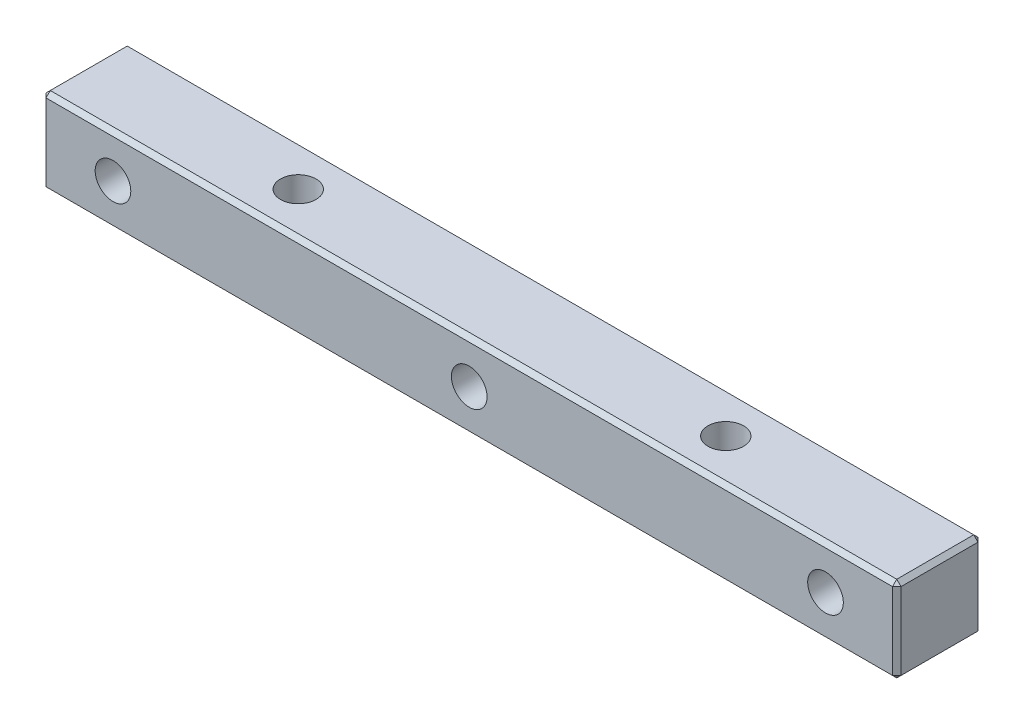
ISO-10303-21;
HEADER;
FILE_DESCRIPTION(('STEP AP214'),'2;1');
FILE_NAME('part.step','',(''),(''),'','','');
FILE_SCHEMA(('AUTOMOTIVE_DESIGN { 1 0 10303 214 1 1 1 1 }'));
ENDSEC;
DATA;
#1=APPLICATION_CONTEXT('core data for automotive mechanical design processes');
#2=APPLICATION_PROTOCOL_DEFINITION('international standard','automotive_design',2000,#1);
#3=PRODUCT_CONTEXT('',#1,'mechanical');
#4=PRODUCT('Part','Part','',(#3));
#5=PRODUCT_RELATED_PRODUCT_CATEGORY('part','',(#4));
#6=PRODUCT_DEFINITION_FORMATION('','',#4);
#7=PRODUCT_DEFINITION_CONTEXT('part definition',#1,'design');
#8=PRODUCT_DEFINITION('design','',#6,#7);
#9=PRODUCT_DEFINITION_SHAPE('','',#8);
#10=(LENGTH_UNIT() NAMED_UNIT(*) SI_UNIT(.MILLI.,.METRE.));
#11=(NAMED_UNIT(*) PLANE_ANGLE_UNIT() SI_UNIT($,.RADIAN.));
#12=(NAMED_UNIT(*) SI_UNIT($,.STERADIAN.) SOLID_ANGLE_UNIT());
#13=UNCERTAINTY_MEASURE_WITH_UNIT(LENGTH_MEASURE(1.E-05),#10,'distance_accuracy_value','');
#14=(GEOMETRIC_REPRESENTATION_CONTEXT(3) GLOBAL_UNCERTAINTY_ASSIGNED_CONTEXT((#13)) GLOBAL_UNIT_ASSIGNED_CONTEXT((#10,
#11,#12)) REPRESENTATION_CONTEXT('',''));
#15=CARTESIAN_POINT('',(0.,0.,0.));
#16=DIRECTION('',(0.,0.,1.));
#17=DIRECTION('',(1.,0.,0.));
#18=AXIS2_PLACEMENT_3D('',#15,#16,#17);
#19=CARTESIAN_POINT('',(30.,-3.,3.));
#20=DIRECTION('',(-1.,0.,0.));
#21=DIRECTION('',(0.,0.,1.));
#22=AXIS2_PLACEMENT_3D('',#19,#20,#21);
#23=PLANE('',#22);
#24=DIRECTION('',(0.,0.,1.));
#25=VECTOR('',#24,1.);
#26=CARTESIAN_POINT('',(30.,2.69999999999999,3.));
#27=LINE('',#26,#25);
#28=CARTESIAN_POINT('',(30.,2.69999999999999,-2.69999999999999));
#29=VERTEX_POINT('',#28);
#30=CARTESIAN_POINT('',(30.,2.69999999999999,2.69999999999999));
#31=VERTEX_POINT('',#30);
#32=EDGE_CURVE('E207',#29,#31,#27,.T.);
#33=ORIENTED_EDGE('',*,*,#32,.T.);
#34=DIRECTION('',(0.,-1.,0.));
#35=VECTOR('',#34,1.);
#36=CARTESIAN_POINT('',(30.,-3.,2.69999999999999));
#37=LINE('',#36,#35);
#38=CARTESIAN_POINT('',(30.,-2.69999999999999,2.69999999999999));
#39=VERTEX_POINT('',#38);
#40=EDGE_CURVE('E11',#31,#39,#37,.T.);
#41=ORIENTED_EDGE('',*,*,#40,.T.);
#42=DIRECTION('',(0.,0.,-1.));
#43=VECTOR('',#42,1.);
#44=CARTESIAN_POINT('',(30.,-2.69999999999999,3.));
#45=LINE('',#44,#43);
#46=CARTESIAN_POINT('',(30.,-2.69999999999999,-2.69999999999999));
#47=VERTEX_POINT('',#46);
#48=EDGE_CURVE('E50',#39,#47,#45,.T.);
#49=ORIENTED_EDGE('',*,*,#48,.T.);
#50=DIRECTION('',(0.,1.,0.));
#51=VECTOR('',#50,1.);
#52=CARTESIAN_POINT('',(30.,3.,-2.69999999999999));
#53=LINE('',#52,#51);
#54=EDGE_CURVE('E209',#47,#29,#53,.T.);
#55=ORIENTED_EDGE('',*,*,#54,.T.);
#56=EDGE_LOOP('',(#33,#41,#49,#55));
#57=FACE_BOUND('',#56,.T.);
#58=ADVANCED_FACE('F40',(#57),#23,.F.);
#59=CARTESIAN_POINT('',(-30.,3.,3.));
#60=DIRECTION('',(0.,-1.,0.));
#61=DIRECTION('',(0.,0.,-1.));
#62=AXIS2_PLACEMENT_3D('',#59,#60,#61);
#63=PLANE('',#62);
#64=DIRECTION('',(-1.,0.,0.));
#65=VECTOR('',#64,1.);
#66=CARTESIAN_POINT('',(-30.,3.,-2.69999999999999));
#67=LINE('',#66,#65);
#68=CARTESIAN_POINT('',(29.7,3.,-2.69999999999999));
#69=VERTEX_POINT('',#68);
#70=CARTESIAN_POINT('',(-29.7,3.,-2.69999999999999));
#71=VERTEX_POINT('',#70);
#72=EDGE_CURVE('E177',#69,#71,#67,.T.);
#73=ORIENTED_EDGE('',*,*,#72,.T.);
#74=DIRECTION('',(0.,0.,1.));
#75=VECTOR('',#74,1.);
#76=CARTESIAN_POINT('',(-29.7,3.,3.));
#77=LINE('',#76,#75);
#78=CARTESIAN_POINT('',(-29.7,3.,2.69999999999999));
#79=VERTEX_POINT('',#78);
#80=EDGE_CURVE('E140',#71,#79,#77,.T.);
#81=ORIENTED_EDGE('',*,*,#80,.T.);
#82=DIRECTION('',(1.,0.,0.));
#83=VECTOR('',#82,1.);
#84=CARTESIAN_POINT('',(-30.,3.,2.69999999999999));
#85=LINE('',#84,#83);
#86=CARTESIAN_POINT('',(29.7,3.,2.69999999999999));
#87=VERTEX_POINT('',#86);
#88=EDGE_CURVE('E169',#79,#87,#85,.T.);
#89=ORIENTED_EDGE('',*,*,#88,.T.);
#90=DIRECTION('',(0.,0.,-1.));
#91=VECTOR('',#90,1.);
#92=CARTESIAN_POINT('',(29.7,3.,3.));
#93=LINE('',#92,#91);
#94=EDGE_CURVE('E171',#87,#69,#93,.T.);
#95=ORIENTED_EDGE('',*,*,#94,.T.);
#96=EDGE_LOOP('',(#73,#81,#89,#95));
#97=FACE_BOUND('',#96,.T.);
#98=CARTESIAN_POINT('',(-15.,3.,0.));
#99=DIRECTION('',(0.,1.,0.));
#100=DIRECTION('',(0.,0.,1.));
#101=AXIS2_PLACEMENT_3D('',#98,#99,#100);
#102=CIRCLE('',#101,1.24999999999999);
#103=CARTESIAN_POINT('',(-15.,3.,1.24999999999999));
#104=VERTEX_POINT('',#103);
#105=EDGE_CURVE('E265',#104,#104,#102,.T.);
#106=ORIENTED_EDGE('',*,*,#105,.F.);
#107=EDGE_LOOP('',(#106));
#108=FACE_BOUND('',#107,.T.);
#109=CARTESIAN_POINT('',(15.,3.,0.));
#110=DIRECTION('',(0.,1.,0.));
#111=DIRECTION('',(0.,0.,1.));
#112=AXIS2_PLACEMENT_3D('',#109,#110,#111);
#113=CIRCLE('',#112,1.24999999999999);
#114=CARTESIAN_POINT('',(15.,3.,1.24999999999998));
#115=VERTEX_POINT('',#114);
#116=EDGE_CURVE('E275',#115,#115,#113,.T.);
#117=ORIENTED_EDGE('',*,*,#116,.F.);
#118=EDGE_LOOP('',(#117));
#119=FACE_BOUND('',#118,.T.);
#120=ADVANCED_FACE('F323',(#97,#108,#119),#63,.F.);
#121=CARTESIAN_POINT('',(-30.,-3.,3.));
#122=DIRECTION('',(1.,0.,0.));
#123=DIRECTION('',(0.,0.,-1.));
#124=AXIS2_PLACEMENT_3D('',#121,#122,#123);
#125=PLANE('',#124);
#126=DIRECTION('',(0.,1.,0.));
#127=VECTOR('',#126,1.);
#128=CARTESIAN_POINT('',(-30.,-3.,2.69999999999999));
#129=LINE('',#128,#127);
#130=CARTESIAN_POINT('',(-30.,-2.69999999999999,2.69999999999999));
#131=VERTEX_POINT('',#130);
#132=CARTESIAN_POINT('',(-30.,2.69999999999999,2.69999999999999));
#133=VERTEX_POINT('',#132);
#134=EDGE_CURVE('E167',#131,#133,#129,.T.);
#135=ORIENTED_EDGE('',*,*,#134,.T.);
#136=DIRECTION('',(0.,0.,-1.));
#137=VECTOR('',#136,1.);
#138=CARTESIAN_POINT('',(-30.,2.69999999999999,3.));
#139=LINE('',#138,#137);
#140=CARTESIAN_POINT('',(-30.,2.69999999999999,-2.69999999999999));
#141=VERTEX_POINT('',#140);
#142=EDGE_CURVE('E138',#133,#141,#139,.T.);
#143=ORIENTED_EDGE('',*,*,#142,.T.);
#144=DIRECTION('',(0.,-1.,0.));
#145=VECTOR('',#144,1.);
#146=CARTESIAN_POINT('',(-30.,-3.,-2.69999999999999));
#147=LINE('',#146,#145);
#148=CARTESIAN_POINT('',(-30.,-2.69999999999999,-2.69999999999999));
#149=VERTEX_POINT('',#148);
#150=EDGE_CURVE('E156',#141,#149,#147,.T.);
#151=ORIENTED_EDGE('',*,*,#150,.T.);
#152=DIRECTION('',(0.,0.,1.));
#153=VECTOR('',#152,1.);
#154=CARTESIAN_POINT('',(-30.,-2.69999999999999,3.));
#155=LINE('',#154,#153);
#156=EDGE_CURVE('E162',#149,#131,#155,.T.);
#157=ORIENTED_EDGE('',*,*,#156,.T.);
#158=EDGE_LOOP('',(#135,#143,#151,#157));
#159=FACE_BOUND('',#158,.T.);
#160=ADVANCED_FACE('F165',(#159),#125,.F.);
#161=CARTESIAN_POINT('',(-30.,-3.,3.));
#162=DIRECTION('',(0.,1.,0.));
#163=DIRECTION('',(0.,0.,1.));
#164=AXIS2_PLACEMENT_3D('',#161,#162,#163);
#165=PLANE('',#164);
#166=DIRECTION('',(-1.,0.,0.));
#167=VECTOR('',#166,1.);
#168=CARTESIAN_POINT('',(-30.,-3.,2.69999999999999));
#169=LINE('',#168,#167);
#170=CARTESIAN_POINT('',(29.7,-3.,2.69999999999999));
#171=VERTEX_POINT('',#170);
#172=CARTESIAN_POINT('',(-29.7,-3.,2.69999999999999));
#173=VERTEX_POINT('',#172);
#174=EDGE_CURVE('E193',#171,#173,#169,.T.);
#175=ORIENTED_EDGE('',*,*,#174,.T.);
#176=DIRECTION('',(0.,0.,-1.));
#177=VECTOR('',#176,1.);
#178=CARTESIAN_POINT('',(-29.7,-3.,3.));
#179=LINE('',#178,#177);
#180=CARTESIAN_POINT('',(-29.7,-3.,-2.69999999999999));
#181=VERTEX_POINT('',#180);
#182=EDGE_CURVE('E195',#173,#181,#179,.T.);
#183=ORIENTED_EDGE('',*,*,#182,.T.);
#184=DIRECTION('',(1.,0.,0.));
#185=VECTOR('',#184,1.);
#186=CARTESIAN_POINT('',(30.,-3.,-2.69999999999999));
#187=LINE('',#186,#185);
#188=CARTESIAN_POINT('',(29.7,-3.,-2.69999999999999));
#189=VERTEX_POINT('',#188);
#190=EDGE_CURVE('E189',#181,#189,#187,.T.);
#191=ORIENTED_EDGE('',*,*,#190,.T.);
#192=DIRECTION('',(0.,0.,1.));
#193=VECTOR('',#192,1.);
#194=CARTESIAN_POINT('',(29.7,-3.,3.));
#195=LINE('',#194,#193);
#196=EDGE_CURVE('E191',#189,#171,#195,.T.);
#197=ORIENTED_EDGE('',*,*,#196,.T.);
#198=EDGE_LOOP('',(#175,#183,#191,#197));
#199=FACE_BOUND('',#198,.T.);
#200=CARTESIAN_POINT('',(-15.,-3.,0.));
#201=DIRECTION('',(0.,1.,0.));
#202=DIRECTION('',(0.,0.,1.));
#203=AXIS2_PLACEMENT_3D('',#200,#201,#202);
#204=CIRCLE('',#203,1.25);
#205=CARTESIAN_POINT('',(-15.,-3.,1.25));
#206=VERTEX_POINT('',#205);
#207=EDGE_CURVE('E270',#206,#206,#204,.T.);
#208=ORIENTED_EDGE('',*,*,#207,.T.);
#209=EDGE_LOOP('',(#208));
#210=FACE_BOUND('',#209,.T.);
#211=CARTESIAN_POINT('',(15.,-3.,0.));
#212=DIRECTION('',(0.,1.,0.));
#213=DIRECTION('',(0.,0.,1.));
#214=AXIS2_PLACEMENT_3D('',#211,#212,#213);
#215=CIRCLE('',#214,1.25);
#216=CARTESIAN_POINT('',(15.,-3.,1.24999999999999));
#217=VERTEX_POINT('',#216);
#218=EDGE_CURVE('E280',#217,#217,#215,.T.);
#219=ORIENTED_EDGE('',*,*,#218,.T.);
#220=EDGE_LOOP('',(#219));
#221=FACE_BOUND('',#220,.T.);
#222=ADVANCED_FACE('F456',(#199,#210,#221),#165,.F.);
#223=CARTESIAN_POINT('',(0.,0.,3.));
#224=DIRECTION('',(0.,0.,-1.));
#225=DIRECTION('',(-1.,0.,0.));
#226=AXIS2_PLACEMENT_3D('',#223,#224,#225);
#227=PLANE('',#226);
#228=DIRECTION('',(0.,-1.,0.));
#229=VECTOR('',#228,1.);
#230=CARTESIAN_POINT('',(-29.7,0.,3.));
#231=LINE('',#230,#229);
#232=CARTESIAN_POINT('',(-29.7,2.69999999999999,3.));
#233=VERTEX_POINT('',#232);
#234=CARTESIAN_POINT('',(-29.7,-2.69999999999999,3.));
#235=VERTEX_POINT('',#234);
#236=EDGE_CURVE('E184',#233,#235,#231,.T.);
#237=ORIENTED_EDGE('',*,*,#236,.T.);
#238=DIRECTION('',(1.,0.,0.));
#239=VECTOR('',#238,1.);
#240=CARTESIAN_POINT('',(0.,-2.69999999999999,3.));
#241=LINE('',#240,#239);
#242=CARTESIAN_POINT('',(29.7,-2.69999999999999,3.));
#243=VERTEX_POINT('',#242);
#244=EDGE_CURVE('E187',#235,#243,#241,.T.);
#245=ORIENTED_EDGE('',*,*,#244,.T.);
#246=DIRECTION('',(0.,1.,0.));
#247=VECTOR('',#246,1.);
#248=CARTESIAN_POINT('',(29.7,0.,3.));
#249=LINE('',#248,#247);
#250=CARTESIAN_POINT('',(29.7,2.69999999999999,3.));
#251=VERTEX_POINT('',#250);
#252=EDGE_CURVE('E182',#243,#251,#249,.T.);
#253=ORIENTED_EDGE('',*,*,#252,.T.);
#254=DIRECTION('',(-1.,0.,0.));
#255=VECTOR('',#254,1.);
#256=CARTESIAN_POINT('',(0.,2.69999999999999,3.));
#257=LINE('',#256,#255);
#258=EDGE_CURVE('E180',#251,#233,#257,.T.);
#259=ORIENTED_EDGE('',*,*,#258,.T.);
#260=EDGE_LOOP('',(#237,#245,#253,#259));
#261=FACE_BOUND('',#260,.T.);
#262=CARTESIAN_POINT('',(-25.,0.,3.));
#263=DIRECTION('',(0.,0.,1.));
#264=DIRECTION('',(1.,0.,0.));
#265=AXIS2_PLACEMENT_3D('',#262,#263,#264);
#266=CIRCLE('',#265,1.24999999999999);
#267=CARTESIAN_POINT('',(-23.75,0.,3.));
#268=VERTEX_POINT('',#267);
#269=EDGE_CURVE('E283',#268,#268,#266,.T.);
#270=ORIENTED_EDGE('',*,*,#269,.F.);
#271=EDGE_LOOP('',(#270));
#272=FACE_BOUND('',#271,.T.);
#273=CARTESIAN_POINT('',(0.,0.,3.));
#274=DIRECTION('',(0.,0.,1.));
#275=DIRECTION('',(1.,0.,0.));
#276=AXIS2_PLACEMENT_3D('',#273,#274,#275);
#277=CIRCLE('',#276,1.24999999999999);
#278=CARTESIAN_POINT('',(1.24999999999999,0.,3.));
#279=VERTEX_POINT('',#278);
#280=EDGE_CURVE('E289',#279,#279,#277,.T.);
#281=ORIENTED_EDGE('',*,*,#280,.F.);
#282=EDGE_LOOP('',(#281));
#283=FACE_BOUND('',#282,.T.);
#284=CARTESIAN_POINT('',(25.,0.,3.));
#285=DIRECTION('',(0.,0.,1.));
#286=DIRECTION('',(1.,0.,0.));
#287=AXIS2_PLACEMENT_3D('',#284,#285,#286);
#288=CIRCLE('',#287,1.24999999999999);
#289=CARTESIAN_POINT('',(26.25,0.,3.));
#290=VERTEX_POINT('',#289);
#291=EDGE_CURVE('E295',#290,#290,#288,.T.);
#292=ORIENTED_EDGE('',*,*,#291,.F.);
#293=EDGE_LOOP('',(#292));
#294=FACE_BOUND('',#293,.T.);
#295=ADVANCED_FACE('F466',(#261,#272,#283,#294),#227,.F.);
#296=CARTESIAN_POINT('',(0.,0.,-3.));
#297=DIRECTION('',(0.,0.,-1.));
#298=DIRECTION('',(-1.,0.,0.));
#299=AXIS2_PLACEMENT_3D('',#296,#297,#298);
#300=PLANE('',#299);
#301=DIRECTION('',(-1.,0.,0.));
#302=VECTOR('',#301,1.);
#303=CARTESIAN_POINT('',(-30.,-2.69999999999999,-3.));
#304=LINE('',#303,#302);
#305=CARTESIAN_POINT('',(29.7,-2.69999999999999,-3.));
#306=VERTEX_POINT('',#305);
#307=CARTESIAN_POINT('',(-29.7,-2.69999999999999,-3.));
#308=VERTEX_POINT('',#307);
#309=EDGE_CURVE('E202',#306,#308,#304,.T.);
#310=ORIENTED_EDGE('',*,*,#309,.T.);
#311=DIRECTION('',(0.,1.,0.));
#312=VECTOR('',#311,1.);
#313=CARTESIAN_POINT('',(-29.7,3.,-3.));
#314=LINE('',#313,#312);
#315=CARTESIAN_POINT('',(-29.7,2.69999999999999,-3.));
#316=VERTEX_POINT('',#315);
#317=EDGE_CURVE('E204',#308,#316,#314,.T.);
#318=ORIENTED_EDGE('',*,*,#317,.T.);
#319=DIRECTION('',(1.,0.,0.));
#320=VECTOR('',#319,1.);
#321=CARTESIAN_POINT('',(30.,2.69999999999999,-3.));
#322=LINE('',#321,#320);
#323=CARTESIAN_POINT('',(29.7,2.69999999999999,-3.));
#324=VERTEX_POINT('',#323);
#325=EDGE_CURVE('E198',#316,#324,#322,.T.);
#326=ORIENTED_EDGE('',*,*,#325,.T.);
#327=DIRECTION('',(0.,-1.,0.));
#328=VECTOR('',#327,1.);
#329=CARTESIAN_POINT('',(29.7,-3.,-3.));
#330=LINE('',#329,#328);
#331=EDGE_CURVE('E200',#324,#306,#330,.T.);
#332=ORIENTED_EDGE('',*,*,#331,.T.);
#333=EDGE_LOOP('',(#310,#318,#326,#332));
#334=FACE_BOUND('',#333,.T.);
#335=CARTESIAN_POINT('',(-25.,0.,-3.));
#336=DIRECTION('',(0.,0.,1.));
#337=DIRECTION('',(1.,0.,0.));
#338=AXIS2_PLACEMENT_3D('',#335,#336,#337);
#339=CIRCLE('',#338,1.25);
#340=CARTESIAN_POINT('',(-23.75,0.,-3.));
#341=VERTEX_POINT('',#340);
#342=EDGE_CURVE('E286',#341,#341,#339,.T.);
#343=ORIENTED_EDGE('',*,*,#342,.T.);
#344=EDGE_LOOP('',(#343));
#345=FACE_BOUND('',#344,.T.);
#346=CARTESIAN_POINT('',(0.,0.,-3.));
#347=DIRECTION('',(0.,0.,1.));
#348=DIRECTION('',(1.,0.,0.));
#349=AXIS2_PLACEMENT_3D('',#346,#347,#348);
#350=CIRCLE('',#349,1.25);
#351=CARTESIAN_POINT('',(1.25,0.,-3.));
#352=VERTEX_POINT('',#351);
#353=EDGE_CURVE('E292',#352,#352,#350,.T.);
#354=ORIENTED_EDGE('',*,*,#353,.T.);
#355=EDGE_LOOP('',(#354));
#356=FACE_BOUND('',#355,.T.);
#357=CARTESIAN_POINT('',(25.,0.,-3.));
#358=DIRECTION('',(0.,0.,1.));
#359=DIRECTION('',(1.,0.,0.));
#360=AXIS2_PLACEMENT_3D('',#357,#358,#359);
#361=CIRCLE('',#360,1.25);
#362=CARTESIAN_POINT('',(26.25,0.,-3.));
#363=VERTEX_POINT('',#362);
#364=EDGE_CURVE('E163',#363,#363,#361,.T.);
#365=ORIENTED_EDGE('',*,*,#364,.T.);
#366=EDGE_LOOP('',(#365));
#367=FACE_BOUND('',#366,.T.);
#368=ADVANCED_FACE('F332',(#334,#345,#356,#367),#300,.T.);
#369=CARTESIAN_POINT('',(25.,0.,3.));
#370=DIRECTION('',(0.,0.,1.));
#371=DIRECTION('',(1.,0.,0.));
#372=AXIS2_PLACEMENT_3D('',#369,#370,#371);
#373=CYLINDRICAL_SURFACE('',#372,1.24999999999999);
#374=ORIENTED_EDGE('',*,*,#364,.F.);
#375=EDGE_LOOP('',(#374));
#376=FACE_BOUND('',#375,.T.);
#377=ORIENTED_EDGE('',*,*,#291,.T.);
#378=EDGE_LOOP('',(#377));
#379=FACE_BOUND('',#378,.T.);
#380=ADVANCED_FACE('F476',(#376,#379),#373,.F.);
#381=CARTESIAN_POINT('',(0.,0.,3.));
#382=DIRECTION('',(0.,0.,1.));
#383=DIRECTION('',(1.,0.,0.));
#384=AXIS2_PLACEMENT_3D('',#381,#382,#383);
#385=CYLINDRICAL_SURFACE('',#384,1.24999999999999);
#386=ORIENTED_EDGE('',*,*,#353,.F.);
#387=EDGE_LOOP('',(#386));
#388=FACE_BOUND('',#387,.T.);
#389=ORIENTED_EDGE('',*,*,#280,.T.);
#390=EDGE_LOOP('',(#389));
#391=FACE_BOUND('',#390,.T.);
#392=ADVANCED_FACE('F478',(#388,#391),#385,.F.);
#393=CARTESIAN_POINT('',(-25.,0.,3.));
#394=DIRECTION('',(0.,0.,1.));
#395=DIRECTION('',(1.,0.,0.));
#396=AXIS2_PLACEMENT_3D('',#393,#394,#395);
#397=CYLINDRICAL_SURFACE('',#396,1.24999999999999);
#398=ORIENTED_EDGE('',*,*,#342,.F.);
#399=EDGE_LOOP('',(#398));
#400=FACE_BOUND('',#399,.T.);
#401=ORIENTED_EDGE('',*,*,#269,.T.);
#402=EDGE_LOOP('',(#401));
#403=FACE_BOUND('',#402,.T.);
#404=ADVANCED_FACE('F485',(#400,#403),#397,.F.);
#405=CARTESIAN_POINT('',(15.,3.,0.));
#406=DIRECTION('',(0.,1.,0.));
#407=DIRECTION('',(0.,0.,1.));
#408=AXIS2_PLACEMENT_3D('',#405,#406,#407);
#409=CYLINDRICAL_SURFACE('',#408,1.24999999999999);
#410=ORIENTED_EDGE('',*,*,#218,.F.);
#411=EDGE_LOOP('',(#410));
#412=FACE_BOUND('',#411,.T.);
#413=ORIENTED_EDGE('',*,*,#116,.T.);
#414=EDGE_LOOP('',(#413));
#415=FACE_BOUND('',#414,.T.);
#416=ADVANCED_FACE('F645',(#412,#415),#409,.F.);
#417=CARTESIAN_POINT('',(-15.,3.,0.));
#418=DIRECTION('',(0.,1.,0.));
#419=DIRECTION('',(0.,0.,1.));
#420=AXIS2_PLACEMENT_3D('',#417,#418,#419);
#421=CYLINDRICAL_SURFACE('',#420,1.24999999999999);
#422=ORIENTED_EDGE('',*,*,#207,.F.);
#423=EDGE_LOOP('',(#422));
#424=FACE_BOUND('',#423,.T.);
#425=ORIENTED_EDGE('',*,*,#105,.T.);
#426=EDGE_LOOP('',(#425));
#427=FACE_BOUND('',#426,.T.);
#428=ADVANCED_FACE('F451',(#424,#427),#421,.F.);
#429=CARTESIAN_POINT('',(30.,-2.69999999999999,3.));
#430=DIRECTION('',(-0.707106781186547,0.707106781186547,0.));
#431=DIRECTION('',(0.,0.,-1.));
#432=AXIS2_PLACEMENT_3D('',#429,#430,#431);
#433=PLANE('',#432);
#434=DIRECTION('',(-0.707106781186547,-0.707106781186547,0.));
#435=VECTOR('',#434,1.);
#436=CARTESIAN_POINT('',(30.,-2.69999999999999,2.69999999999999));
#437=LINE('',#436,#435);
#438=EDGE_CURVE('E45',#171,#39,#437,.F.);
#439=ORIENTED_EDGE('',*,*,#438,.F.);
#440=ORIENTED_EDGE('',*,*,#196,.F.);
#441=DIRECTION('',(0.707106781186547,0.707106781186547,0.));
#442=VECTOR('',#441,1.);
#443=CARTESIAN_POINT('',(30.,-2.69999999999999,-2.69999999999999));
#444=LINE('',#443,#442);
#445=EDGE_CURVE('E260',#47,#189,#444,.F.);
#446=ORIENTED_EDGE('',*,*,#445,.F.);
#447=ORIENTED_EDGE('',*,*,#48,.F.);
#448=EDGE_LOOP('',(#439,#440,#446,#447));
#449=FACE_BOUND('',#448,.T.);
#450=ADVANCED_FACE('F43',(#449),#433,.F.);
#451=CARTESIAN_POINT('',(30.,-2.69999999999999,2.69999999999999));
#452=DIRECTION('',(0.577350269189626,-0.577350269189626,0.577350269189626));
#453=DIRECTION('',(0.707106781186547,0.,-0.707106781186547));
#454=AXIS2_PLACEMENT_3D('',#451,#452,#453);
#455=PLANE('',#454);
#456=DIRECTION('',(0.,0.707106781186547,0.707106781186547));
#457=VECTOR('',#456,1.);
#458=CARTESIAN_POINT('',(29.7,-2.85,2.85));
#459=LINE('',#458,#457);
#460=EDGE_CURVE('E257',#171,#243,#459,.T.);
#461=ORIENTED_EDGE('',*,*,#460,.F.);
#462=ORIENTED_EDGE('',*,*,#438,.T.);
#463=DIRECTION('',(0.707106781186547,0.,-0.707106781186547));
#464=VECTOR('',#463,1.);
#465=CARTESIAN_POINT('',(30.,-2.69999999999999,2.69999999999999));
#466=LINE('',#465,#464);
#467=EDGE_CURVE('E58',#243,#39,#466,.T.);
#468=ORIENTED_EDGE('',*,*,#467,.F.);
#469=EDGE_LOOP('',(#461,#462,#468));
#470=FACE_BOUND('',#469,.T.);
#471=ADVANCED_FACE('F443',(#470),#455,.T.);
#472=CARTESIAN_POINT('',(30.,-2.69999999999999,-2.69999999999999));
#473=DIRECTION('',(0.577350269189626,-0.577350269189626,-0.577350269189626));
#474=DIRECTION('',(-0.707106781186547,0.,-0.707106781186547));
#475=AXIS2_PLACEMENT_3D('',#472,#473,#474);
#476=PLANE('',#475);
#477=DIRECTION('',(0.707106781186547,0.,0.707106781186547));
#478=VECTOR('',#477,1.);
#479=CARTESIAN_POINT('',(30.,-2.69999999999999,-2.69999999999999));
#480=LINE('',#479,#478);
#481=EDGE_CURVE('E251',#47,#306,#480,.F.);
#482=ORIENTED_EDGE('',*,*,#481,.F.);
#483=ORIENTED_EDGE('',*,*,#445,.T.);
#484=DIRECTION('',(0.,0.707106781186547,-0.707106781186547));
#485=VECTOR('',#484,1.);
#486=CARTESIAN_POINT('',(29.7,-2.85,-2.85));
#487=LINE('',#486,#485);
#488=EDGE_CURVE('E254',#306,#189,#487,.F.);
#489=ORIENTED_EDGE('',*,*,#488,.F.);
#490=EDGE_LOOP('',(#482,#483,#489));
#491=FACE_BOUND('',#490,.T.);
#492=ADVANCED_FACE('F440',(#491),#476,.T.);
#493=CARTESIAN_POINT('',(29.7,0.,3.));
#494=DIRECTION('',(-0.707106781186547,0.,-0.707106781186547));
#495=DIRECTION('',(0.,1.,0.));
#496=AXIS2_PLACEMENT_3D('',#493,#494,#495);
#497=PLANE('',#496);
#498=ORIENTED_EDGE('',*,*,#467,.T.);
#499=ORIENTED_EDGE('',*,*,#40,.F.);
#500=DIRECTION('',(-0.707106781186547,0.,0.707106781186547));
#501=VECTOR('',#500,1.);
#502=CARTESIAN_POINT('',(29.7,2.69999999999999,3.));
#503=LINE('',#502,#501);
#504=EDGE_CURVE('E245',#251,#31,#503,.F.);
#505=ORIENTED_EDGE('',*,*,#504,.F.);
#506=ORIENTED_EDGE('',*,*,#252,.F.);
#507=EDGE_LOOP('',(#498,#499,#505,#506));
#508=FACE_BOUND('',#507,.T.);
#509=ADVANCED_FACE('F435',(#508),#497,.F.);
#510=CARTESIAN_POINT('',(0.,-2.69999999999999,3.));
#511=DIRECTION('',(0.,0.707106781186547,-0.707106781186547));
#512=DIRECTION('',(1.,0.,0.));
#513=AXIS2_PLACEMENT_3D('',#510,#511,#512);
#514=PLANE('',#513);
#515=ORIENTED_EDGE('',*,*,#460,.T.);
#516=ORIENTED_EDGE('',*,*,#244,.F.);
#517=DIRECTION('',(0.,-0.707106781186547,-0.707106781186547));
#518=VECTOR('',#517,1.);
#519=CARTESIAN_POINT('',(-29.7,-2.69999999999999,3.));
#520=LINE('',#519,#518);
#521=EDGE_CURVE('E242',#173,#235,#520,.F.);
#522=ORIENTED_EDGE('',*,*,#521,.F.);
#523=ORIENTED_EDGE('',*,*,#174,.F.);
#524=EDGE_LOOP('',(#515,#516,#522,#523));
#525=FACE_BOUND('',#524,.T.);
#526=ADVANCED_FACE('F430',(#525),#514,.F.);
#527=CARTESIAN_POINT('',(-29.7,-3.,3.));
#528=DIRECTION('',(0.707106781186547,0.707106781186547,0.));
#529=DIRECTION('',(0.,0.,-1.));
#530=AXIS2_PLACEMENT_3D('',#527,#528,#529);
#531=PLANE('',#530);
#532=DIRECTION('',(0.707106781186547,-0.707106781186547,0.));
#533=VECTOR('',#532,1.);
#534=CARTESIAN_POINT('',(-29.7,-3.,-2.69999999999999));
#535=LINE('',#534,#533);
#536=EDGE_CURVE('E236',#181,#149,#535,.F.);
#537=ORIENTED_EDGE('',*,*,#536,.F.);
#538=ORIENTED_EDGE('',*,*,#182,.F.);
#539=DIRECTION('',(-0.707106781186547,0.707106781186547,0.));
#540=VECTOR('',#539,1.);
#541=CARTESIAN_POINT('',(-29.85,-2.85,2.69999999999999));
#542=LINE('',#541,#540);
#543=EDGE_CURVE('E239',#131,#173,#542,.F.);
#544=ORIENTED_EDGE('',*,*,#543,.F.);
#545=ORIENTED_EDGE('',*,*,#156,.F.);
#546=EDGE_LOOP('',(#537,#538,#544,#545));
#547=FACE_BOUND('',#546,.T.);
#548=ADVANCED_FACE('F304',(#547),#531,.F.);
#549=CARTESIAN_POINT('',(-30.,-3.,-2.69999999999999));
#550=DIRECTION('',(0.,-0.707106781186547,-0.707106781186547));
#551=DIRECTION('',(-1.,0.,0.));
#552=AXIS2_PLACEMENT_3D('',#549,#550,#551);
#553=PLANE('',#552);
#554=ORIENTED_EDGE('',*,*,#488,.T.);
#555=ORIENTED_EDGE('',*,*,#190,.F.);
#556=DIRECTION('',(0.,-0.707106781186547,0.707106781186547));
#557=VECTOR('',#556,1.);
#558=CARTESIAN_POINT('',(-29.7,-3.,-2.69999999999999));
#559=LINE('',#558,#557);
#560=EDGE_CURVE('E234',#308,#181,#559,.T.);
#561=ORIENTED_EDGE('',*,*,#560,.F.);
#562=ORIENTED_EDGE('',*,*,#309,.F.);
#563=EDGE_LOOP('',(#554,#555,#561,#562));
#564=FACE_BOUND('',#563,.T.);
#565=ADVANCED_FACE('F338',(#564),#553,.T.);
#566=CARTESIAN_POINT('',(30.,-3.,-2.69999999999999));
#567=DIRECTION('',(0.707106781186547,0.,-0.707106781186547));
#568=DIRECTION('',(0.,-1.,0.));
#569=AXIS2_PLACEMENT_3D('',#566,#567,#568);
#570=PLANE('',#569);
#571=ORIENTED_EDGE('',*,*,#481,.T.);
#572=ORIENTED_EDGE('',*,*,#331,.F.);
#573=DIRECTION('',(-0.707106781186547,0.,-0.707106781186547));
#574=VECTOR('',#573,1.);
#575=CARTESIAN_POINT('',(30.,2.69999999999999,-2.69999999999999));
#576=LINE('',#575,#574);
#577=EDGE_CURVE('E231',#29,#324,#576,.T.);
#578=ORIENTED_EDGE('',*,*,#577,.F.);
#579=ORIENTED_EDGE('',*,*,#54,.F.);
#580=EDGE_LOOP('',(#571,#572,#578,#579));
#581=FACE_BOUND('',#580,.T.);
#582=ADVANCED_FACE('F417',(#581),#570,.T.);
#583=CARTESIAN_POINT('',(29.7,3.,3.));
#584=DIRECTION('',(-0.707106781186547,-0.707106781186547,0.));
#585=DIRECTION('',(0.,0.,-1.));
#586=AXIS2_PLACEMENT_3D('',#583,#584,#585);
#587=PLANE('',#586);
#588=DIRECTION('',(0.707106781186547,-0.707106781186547,0.));
#589=VECTOR('',#588,1.);
#590=CARTESIAN_POINT('',(29.85,2.85,2.69999999999999));
#591=LINE('',#590,#589);
#592=EDGE_CURVE('E248',#31,#87,#591,.F.);
#593=ORIENTED_EDGE('',*,*,#592,.F.);
#594=ORIENTED_EDGE('',*,*,#32,.F.);
#595=DIRECTION('',(-0.707106781186547,0.707106781186547,0.));
#596=VECTOR('',#595,1.);
#597=CARTESIAN_POINT('',(30.,2.69999999999999,-2.69999999999999));
#598=LINE('',#597,#596);
#599=EDGE_CURVE('E228',#69,#29,#598,.F.);
#600=ORIENTED_EDGE('',*,*,#599,.F.);
#601=ORIENTED_EDGE('',*,*,#94,.F.);
#602=EDGE_LOOP('',(#593,#594,#600,#601));
#603=FACE_BOUND('',#602,.T.);
#604=ADVANCED_FACE('F412',(#603),#587,.F.);
#605=CARTESIAN_POINT('',(29.7,2.69999999999999,3.));
#606=DIRECTION('',(0.577350269189626,0.577350269189626,0.577350269189626));
#607=DIRECTION('',(0.707106781186547,0.,-0.707106781186547));
#608=AXIS2_PLACEMENT_3D('',#605,#606,#607);
#609=PLANE('',#608);
#610=ORIENTED_EDGE('',*,*,#504,.T.);
#611=ORIENTED_EDGE('',*,*,#592,.T.);
#612=DIRECTION('',(0.,0.707106781186547,-0.707106781186547));
#613=VECTOR('',#612,1.);
#614=CARTESIAN_POINT('',(29.7,2.69999999999999,3.));
#615=LINE('',#614,#613);
#616=EDGE_CURVE('E225',#251,#87,#615,.T.);
#617=ORIENTED_EDGE('',*,*,#616,.F.);
#618=EDGE_LOOP('',(#610,#611,#617));
#619=FACE_BOUND('',#618,.T.);
#620=ADVANCED_FACE('F350',(#619),#609,.T.);
#621=CARTESIAN_POINT('',(-29.7,-2.69999999999999,3.));
#622=DIRECTION('',(-0.577350269189626,-0.577350269189626,0.577350269189626));
#623=DIRECTION('',(0.707106781186547,0.,0.707106781186547));
#624=AXIS2_PLACEMENT_3D('',#621,#622,#623);
#625=PLANE('',#624);
#626=ORIENTED_EDGE('',*,*,#543,.T.);
#627=ORIENTED_EDGE('',*,*,#521,.T.);
#628=DIRECTION('',(0.707106781186547,0.,0.707106781186547));
#629=VECTOR('',#628,1.);
#630=CARTESIAN_POINT('',(-29.7,-2.69999999999999,3.));
#631=LINE('',#630,#629);
#632=EDGE_CURVE('E223',#131,#235,#631,.T.);
#633=ORIENTED_EDGE('',*,*,#632,.F.);
#634=EDGE_LOOP('',(#626,#627,#633));
#635=FACE_BOUND('',#634,.T.);
#636=ADVANCED_FACE('F307',(#635),#625,.T.);
#637=CARTESIAN_POINT('',(-29.7,-3.,-2.69999999999999));
#638=DIRECTION('',(-0.577350269189626,-0.577350269189626,-0.577350269189626));
#639=DIRECTION('',(-0.707106781186547,0.,0.707106781186547));
#640=AXIS2_PLACEMENT_3D('',#637,#638,#639);
#641=PLANE('',#640);
#642=ORIENTED_EDGE('',*,*,#560,.T.);
#643=ORIENTED_EDGE('',*,*,#536,.T.);
#644=DIRECTION('',(0.707106781186547,0.,-0.707106781186547));
#645=VECTOR('',#644,1.);
#646=CARTESIAN_POINT('',(-29.85,-2.69999999999999,-2.85));
#647=LINE('',#646,#645);
#648=EDGE_CURVE('E159',#308,#149,#647,.F.);
#649=ORIENTED_EDGE('',*,*,#648,.F.);
#650=EDGE_LOOP('',(#642,#643,#649));
#651=FACE_BOUND('',#650,.T.);
#652=ADVANCED_FACE('F340',(#651),#641,.T.);
#653=CARTESIAN_POINT('',(30.,2.69999999999999,-2.69999999999999));
#654=DIRECTION('',(0.577350269189626,0.577350269189626,-0.577350269189626));
#655=DIRECTION('',(-0.707106781186547,0.,-0.707106781186547));
#656=AXIS2_PLACEMENT_3D('',#653,#654,#655);
#657=PLANE('',#656);
#658=ORIENTED_EDGE('',*,*,#599,.T.);
#659=ORIENTED_EDGE('',*,*,#577,.T.);
#660=DIRECTION('',(0.,0.707106781186547,0.707106781186547));
#661=VECTOR('',#660,1.);
#662=CARTESIAN_POINT('',(29.7,2.85,-2.85));
#663=LINE('',#662,#661);
#664=EDGE_CURVE('E219',#69,#324,#663,.F.);
#665=ORIENTED_EDGE('',*,*,#664,.F.);
#666=EDGE_LOOP('',(#658,#659,#665));
#667=FACE_BOUND('',#666,.T.);
#668=ADVANCED_FACE('F342',(#667),#657,.T.);
#669=CARTESIAN_POINT('',(0.,2.69999999999999,3.));
#670=DIRECTION('',(0.,-0.707106781186547,-0.707106781186547));
#671=DIRECTION('',(-1.,0.,0.));
#672=AXIS2_PLACEMENT_3D('',#669,#670,#671);
#673=PLANE('',#672);
#674=ORIENTED_EDGE('',*,*,#616,.T.);
#675=ORIENTED_EDGE('',*,*,#88,.F.);
#676=DIRECTION('',(0.,-0.707106781186547,0.707106781186547));
#677=VECTOR('',#676,1.);
#678=CARTESIAN_POINT('',(-29.7,3.,2.69999999999999));
#679=LINE('',#678,#677);
#680=EDGE_CURVE('E216',#233,#79,#679,.F.);
#681=ORIENTED_EDGE('',*,*,#680,.F.);
#682=ORIENTED_EDGE('',*,*,#258,.F.);
#683=EDGE_LOOP('',(#674,#675,#681,#682));
#684=FACE_BOUND('',#683,.T.);
#685=ADVANCED_FACE('F319',(#684),#673,.F.);
#686=CARTESIAN_POINT('',(-29.7,0.,3.));
#687=DIRECTION('',(0.707106781186547,0.,-0.707106781186547));
#688=DIRECTION('',(0.,-1.,0.));
#689=AXIS2_PLACEMENT_3D('',#686,#687,#688);
#690=PLANE('',#689);
#691=ORIENTED_EDGE('',*,*,#632,.T.);
#692=ORIENTED_EDGE('',*,*,#236,.F.);
#693=DIRECTION('',(-0.707106781186547,0.,-0.707106781186547));
#694=VECTOR('',#693,1.);
#695=CARTESIAN_POINT('',(-29.85,2.69999999999999,2.85));
#696=LINE('',#695,#694);
#697=EDGE_CURVE('E153',#133,#233,#696,.F.);
#698=ORIENTED_EDGE('',*,*,#697,.F.);
#699=ORIENTED_EDGE('',*,*,#134,.F.);
#700=EDGE_LOOP('',(#691,#692,#698,#699));
#701=FACE_BOUND('',#700,.T.);
#702=ADVANCED_FACE('F311',(#701),#690,.F.);
#703=CARTESIAN_POINT('',(-30.,-3.,-2.69999999999999));
#704=DIRECTION('',(-0.707106781186547,0.,-0.707106781186547));
#705=DIRECTION('',(0.,1.,0.));
#706=AXIS2_PLACEMENT_3D('',#703,#704,#705);
#707=PLANE('',#706);
#708=ORIENTED_EDGE('',*,*,#648,.T.);
#709=ORIENTED_EDGE('',*,*,#150,.F.);
#710=DIRECTION('',(-0.707106781186547,0.,0.707106781186547));
#711=VECTOR('',#710,1.);
#712=CARTESIAN_POINT('',(-30.,2.69999999999999,-2.69999999999999));
#713=LINE('',#712,#711);
#714=EDGE_CURVE('E145',#316,#141,#713,.T.);
#715=ORIENTED_EDGE('',*,*,#714,.F.);
#716=ORIENTED_EDGE('',*,*,#317,.F.);
#717=EDGE_LOOP('',(#708,#709,#715,#716));
#718=FACE_BOUND('',#717,.T.);
#719=ADVANCED_FACE('F157',(#718),#707,.T.);
#720=CARTESIAN_POINT('',(-30.,3.,-2.69999999999999));
#721=DIRECTION('',(0.,0.707106781186547,-0.707106781186547));
#722=DIRECTION('',(1.,0.,0.));
#723=AXIS2_PLACEMENT_3D('',#720,#721,#722);
#724=PLANE('',#723);
#725=ORIENTED_EDGE('',*,*,#664,.T.);
#726=ORIENTED_EDGE('',*,*,#325,.F.);
#727=DIRECTION('',(0.,-0.707106781186547,-0.707106781186547));
#728=VECTOR('',#727,1.);
#729=CARTESIAN_POINT('',(-29.7,2.85,-2.85));
#730=LINE('',#729,#728);
#731=EDGE_CURVE('E149',#71,#316,#730,.T.);
#732=ORIENTED_EDGE('',*,*,#731,.F.);
#733=ORIENTED_EDGE('',*,*,#72,.F.);
#734=EDGE_LOOP('',(#725,#726,#732,#733));
#735=FACE_BOUND('',#734,.T.);
#736=ADVANCED_FACE('F328',(#735),#724,.T.);
#737=CARTESIAN_POINT('',(-29.7,3.,2.69999999999999));
#738=DIRECTION('',(-0.577350269189626,0.577350269189626,0.577350269189626));
#739=DIRECTION('',(0.707106781186547,0.,0.707106781186547));
#740=AXIS2_PLACEMENT_3D('',#737,#738,#739);
#741=PLANE('',#740);
#742=ORIENTED_EDGE('',*,*,#697,.T.);
#743=ORIENTED_EDGE('',*,*,#680,.T.);
#744=DIRECTION('',(0.707106781186547,0.707106781186547,0.));
#745=VECTOR('',#744,1.);
#746=CARTESIAN_POINT('',(-29.7,3.,2.69999999999999));
#747=LINE('',#746,#745);
#748=EDGE_CURVE('E142',#133,#79,#747,.T.);
#749=ORIENTED_EDGE('',*,*,#748,.F.);
#750=EDGE_LOOP('',(#742,#743,#749));
#751=FACE_BOUND('',#750,.T.);
#752=ADVANCED_FACE('F315',(#751),#741,.T.);
#753=CARTESIAN_POINT('',(-30.,2.69999999999999,-2.69999999999999));
#754=DIRECTION('',(-0.577350269189626,0.577350269189626,-0.577350269189626));
#755=DIRECTION('',(-0.707106781186547,0.,0.707106781186547));
#756=AXIS2_PLACEMENT_3D('',#753,#754,#755);
#757=PLANE('',#756);
#758=ORIENTED_EDGE('',*,*,#731,.T.);
#759=ORIENTED_EDGE('',*,*,#714,.T.);
#760=DIRECTION('',(-0.707106781186547,-0.707106781186547,0.));
#761=VECTOR('',#760,1.);
#762=CARTESIAN_POINT('',(-30.,2.69999999999999,-2.69999999999999));
#763=LINE('',#762,#761);
#764=EDGE_CURVE('E134',#71,#141,#763,.T.);
#765=ORIENTED_EDGE('',*,*,#764,.F.);
#766=EDGE_LOOP('',(#758,#759,#765));
#767=FACE_BOUND('',#766,.T.);
#768=ADVANCED_FACE('F147',(#767),#757,.T.);
#769=CARTESIAN_POINT('',(-30.,2.69999999999999,3.));
#770=DIRECTION('',(0.707106781186547,-0.707106781186547,0.));
#771=DIRECTION('',(0.,0.,-1.));
#772=AXIS2_PLACEMENT_3D('',#769,#770,#771);
#773=PLANE('',#772);
#774=ORIENTED_EDGE('',*,*,#748,.T.);
#775=ORIENTED_EDGE('',*,*,#80,.F.);
#776=ORIENTED_EDGE('',*,*,#764,.T.);
#777=ORIENTED_EDGE('',*,*,#142,.F.);
#778=EDGE_LOOP('',(#774,#775,#776,#777));
#779=FACE_BOUND('',#778,.T.);
#780=ADVANCED_FACE('F136',(#779),#773,.F.);
#781=CLOSED_SHELL('',(#58,#120,#160,#222,#295,#368,#380,#392,#404,#416,#428,#450,#471,#492,#509,
#526,#548,#565,#582,#604,#620,#636,#652,#668,#685,#702,#719,#736,#752,#768,#780));
#782=MANIFOLD_SOLID_BREP('B2',#781);
#783=ADVANCED_BREP_SHAPE_REPRESENTATION('',(#18,#782),#14);
#784=SHAPE_DEFINITION_REPRESENTATION(#9,#783);
ENDSEC;
END-ISO-10303-21;
